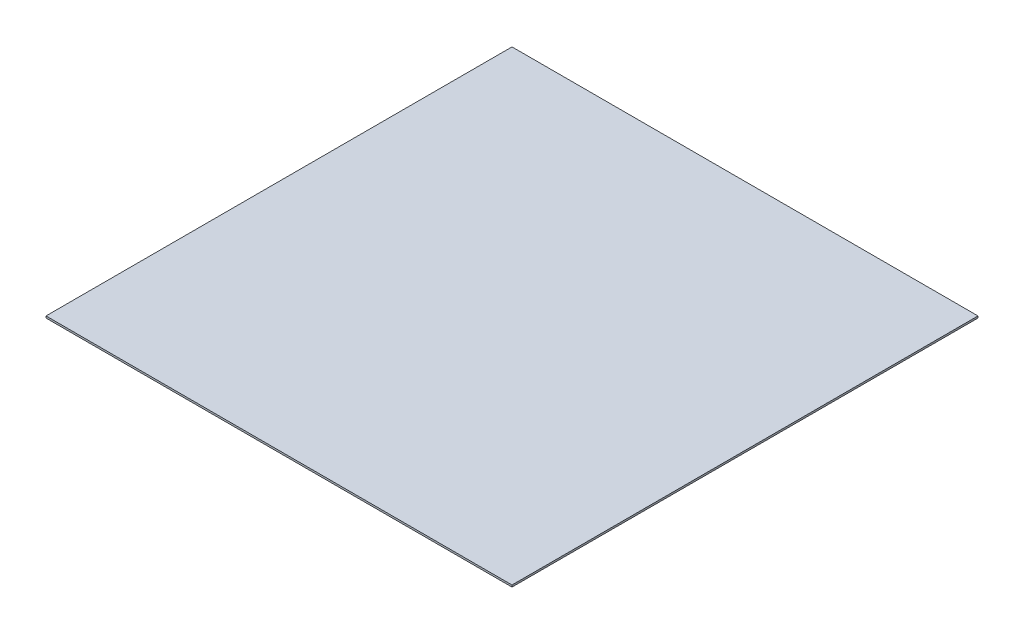
ISO-10303-21;
HEADER;
FILE_DESCRIPTION(('STEP AP214'),'2;1');
FILE_NAME('part.step','',(''),(''),'','','');
FILE_SCHEMA(('AUTOMOTIVE_DESIGN { 1 0 10303 214 1 1 1 1 }'));
ENDSEC;
DATA;
#1=APPLICATION_CONTEXT('core data for automotive mechanical design processes');
#2=APPLICATION_PROTOCOL_DEFINITION('international standard','automotive_design',2000,#1);
#3=PRODUCT_CONTEXT('',#1,'mechanical');
#4=PRODUCT('Part','Part','',(#3));
#5=PRODUCT_RELATED_PRODUCT_CATEGORY('part','',(#4));
#6=PRODUCT_DEFINITION_FORMATION('','',#4);
#7=PRODUCT_DEFINITION_CONTEXT('part definition',#1,'design');
#8=PRODUCT_DEFINITION('design','',#6,#7);
#9=PRODUCT_DEFINITION_SHAPE('','',#8);
#10=(LENGTH_UNIT() NAMED_UNIT(*) SI_UNIT(.MILLI.,.METRE.));
#11=(NAMED_UNIT(*) PLANE_ANGLE_UNIT() SI_UNIT($,.RADIAN.));
#12=(NAMED_UNIT(*) SI_UNIT($,.STERADIAN.) SOLID_ANGLE_UNIT());
#13=UNCERTAINTY_MEASURE_WITH_UNIT(LENGTH_MEASURE(1.E-05),#10,'distance_accuracy_value','');
#14=(GEOMETRIC_REPRESENTATION_CONTEXT(3) GLOBAL_UNCERTAINTY_ASSIGNED_CONTEXT((#13)) GLOBAL_UNIT_ASSIGNED_CONTEXT((#10,
#11,#12)) REPRESENTATION_CONTEXT('',''));
#15=CARTESIAN_POINT('',(0.,0.,0.));
#16=DIRECTION('',(0.,0.,1.));
#17=DIRECTION('',(1.,0.,0.));
#18=AXIS2_PLACEMENT_3D('',#15,#16,#17);
#19=CARTESIAN_POINT('',(125.,1.,125.));
#20=DIRECTION('',(-1.,0.,0.));
#21=DIRECTION('',(0.,0.,1.));
#22=AXIS2_PLACEMENT_3D('',#19,#20,#21);
#23=PLANE('',#22);
#24=DIRECTION('',(0.,0.,-1.));
#25=VECTOR('',#24,1.);
#26=CARTESIAN_POINT('',(125.,0.,125.));
#27=LINE('',#26,#25);
#28=CARTESIAN_POINT('',(125.,0.,125.));
#29=VERTEX_POINT('',#28);
#30=CARTESIAN_POINT('',(125.,0.,-125.));
#31=VERTEX_POINT('',#30);
#32=EDGE_CURVE('E113',#29,#31,#27,.T.);
#33=ORIENTED_EDGE('',*,*,#32,.T.);
#34=DIRECTION('',(0.,-1.,0.));
#35=VECTOR('',#34,1.);
#36=CARTESIAN_POINT('',(125.,1.,-125.));
#37=LINE('',#36,#35);
#38=CARTESIAN_POINT('',(125.,1.,-125.));
#39=VERTEX_POINT('',#38);
#40=EDGE_CURVE('E11',#39,#31,#37,.T.);
#41=ORIENTED_EDGE('',*,*,#40,.F.);
#42=DIRECTION('',(0.,0.,-1.));
#43=VECTOR('',#42,1.);
#44=CARTESIAN_POINT('',(125.,1.,125.));
#45=LINE('',#44,#43);
#46=CARTESIAN_POINT('',(125.,1.,125.));
#47=VERTEX_POINT('',#46);
#48=EDGE_CURVE('E97',#47,#39,#45,.T.);
#49=ORIENTED_EDGE('',*,*,#48,.F.);
#50=DIRECTION('',(0.,-1.,0.));
#51=VECTOR('',#50,1.);
#52=CARTESIAN_POINT('',(125.,1.,125.));
#53=LINE('',#52,#51);
#54=EDGE_CURVE('E109',#47,#29,#53,.T.);
#55=ORIENTED_EDGE('',*,*,#54,.T.);
#56=EDGE_LOOP('',(#33,#41,#49,#55));
#57=FACE_BOUND('',#56,.T.);
#58=ADVANCED_FACE('F45',(#57),#23,.F.);
#59=CARTESIAN_POINT('',(-125.,1.,-125.));
#60=DIRECTION('',(0.,0.,1.));
#61=DIRECTION('',(1.,0.,0.));
#62=AXIS2_PLACEMENT_3D('',#59,#60,#61);
#63=PLANE('',#62);
#64=DIRECTION('',(-1.,0.,0.));
#65=VECTOR('',#64,1.);
#66=CARTESIAN_POINT('',(-125.,0.,-125.));
#67=LINE('',#66,#65);
#68=CARTESIAN_POINT('',(-125.,0.,-125.));
#69=VERTEX_POINT('',#68);
#70=EDGE_CURVE('E102',#31,#69,#67,.T.);
#71=ORIENTED_EDGE('',*,*,#70,.T.);
#72=DIRECTION('',(0.,-1.,0.));
#73=VECTOR('',#72,1.);
#74=CARTESIAN_POINT('',(-125.,1.,-125.));
#75=LINE('',#74,#73);
#76=CARTESIAN_POINT('',(-125.,1.,-125.));
#77=VERTEX_POINT('',#76);
#78=EDGE_CURVE('E54',#77,#69,#75,.T.);
#79=ORIENTED_EDGE('',*,*,#78,.F.);
#80=DIRECTION('',(-1.,0.,0.));
#81=VECTOR('',#80,1.);
#82=CARTESIAN_POINT('',(-125.,1.,-125.));
#83=LINE('',#82,#81);
#84=EDGE_CURVE('E92',#39,#77,#83,.T.);
#85=ORIENTED_EDGE('',*,*,#84,.F.);
#86=ORIENTED_EDGE('',*,*,#40,.T.);
#87=EDGE_LOOP('',(#71,#79,#85,#86));
#88=FACE_BOUND('',#87,.T.);
#89=ADVANCED_FACE('F101',(#88),#63,.F.);
#90=CARTESIAN_POINT('',(-125.,1.,125.));
#91=DIRECTION('',(1.,0.,0.));
#92=DIRECTION('',(0.,0.,-1.));
#93=AXIS2_PLACEMENT_3D('',#90,#91,#92);
#94=PLANE('',#93);
#95=DIRECTION('',(0.,0.,1.));
#96=VECTOR('',#95,1.);
#97=CARTESIAN_POINT('',(-125.,0.,125.));
#98=LINE('',#97,#96);
#99=CARTESIAN_POINT('',(-125.,0.,125.));
#100=VERTEX_POINT('',#99);
#101=EDGE_CURVE('E79',#69,#100,#98,.T.);
#102=ORIENTED_EDGE('',*,*,#101,.T.);
#103=DIRECTION('',(0.,-1.,0.));
#104=VECTOR('',#103,1.);
#105=CARTESIAN_POINT('',(-125.,1.,125.));
#106=LINE('',#105,#104);
#107=CARTESIAN_POINT('',(-125.,1.,125.));
#108=VERTEX_POINT('',#107);
#109=EDGE_CURVE('E104',#108,#100,#106,.T.);
#110=ORIENTED_EDGE('',*,*,#109,.F.);
#111=DIRECTION('',(0.,0.,1.));
#112=VECTOR('',#111,1.);
#113=CARTESIAN_POINT('',(-125.,1.,125.));
#114=LINE('',#113,#112);
#115=EDGE_CURVE('E95',#77,#108,#114,.T.);
#116=ORIENTED_EDGE('',*,*,#115,.F.);
#117=ORIENTED_EDGE('',*,*,#78,.T.);
#118=EDGE_LOOP('',(#102,#110,#116,#117));
#119=FACE_BOUND('',#118,.T.);
#120=ADVANCED_FACE('F105',(#119),#94,.F.);
#121=CARTESIAN_POINT('',(-125.,1.,125.));
#122=DIRECTION('',(0.,0.,-1.));
#123=DIRECTION('',(-1.,0.,0.));
#124=AXIS2_PLACEMENT_3D('',#121,#122,#123);
#125=PLANE('',#124);
#126=DIRECTION('',(1.,0.,0.));
#127=VECTOR('',#126,1.);
#128=CARTESIAN_POINT('',(-125.,0.,125.));
#129=LINE('',#128,#127);
#130=EDGE_CURVE('E85',#100,#29,#129,.T.);
#131=ORIENTED_EDGE('',*,*,#130,.T.);
#132=ORIENTED_EDGE('',*,*,#54,.F.);
#133=DIRECTION('',(1.,0.,0.));
#134=VECTOR('',#133,1.);
#135=CARTESIAN_POINT('',(-125.,1.,125.));
#136=LINE('',#135,#134);
#137=EDGE_CURVE('E62',#108,#47,#136,.T.);
#138=ORIENTED_EDGE('',*,*,#137,.F.);
#139=ORIENTED_EDGE('',*,*,#109,.T.);
#140=EDGE_LOOP('',(#131,#132,#138,#139));
#141=FACE_BOUND('',#140,.T.);
#142=ADVANCED_FACE('F126',(#141),#125,.F.);
#143=CARTESIAN_POINT('',(0.,1.,0.));
#144=DIRECTION('',(0.,-1.,0.));
#145=DIRECTION('',(0.,0.,-1.));
#146=AXIS2_PLACEMENT_3D('',#143,#144,#145);
#147=PLANE('',#146);
#148=ORIENTED_EDGE('',*,*,#48,.T.);
#149=ORIENTED_EDGE('',*,*,#84,.T.);
#150=ORIENTED_EDGE('',*,*,#115,.T.);
#151=ORIENTED_EDGE('',*,*,#137,.T.);
#152=EDGE_LOOP('',(#148,#149,#150,#151));
#153=FACE_BOUND('',#152,.T.);
#154=ADVANCED_FACE('F93',(#153),#147,.F.);
#155=CARTESIAN_POINT('',(0.,0.,0.));
#156=DIRECTION('',(0.,-1.,0.));
#157=DIRECTION('',(0.,0.,-1.));
#158=AXIS2_PLACEMENT_3D('',#155,#156,#157);
#159=PLANE('',#158);
#160=ORIENTED_EDGE('',*,*,#32,.F.);
#161=ORIENTED_EDGE('',*,*,#130,.F.);
#162=ORIENTED_EDGE('',*,*,#101,.F.);
#163=ORIENTED_EDGE('',*,*,#70,.F.);
#164=EDGE_LOOP('',(#160,#161,#162,#163));
#165=FACE_BOUND('',#164,.T.);
#166=ADVANCED_FACE('F129',(#165),#159,.T.);
#167=CLOSED_SHELL('',(#58,#89,#120,#142,#154,#166));
#168=MANIFOLD_SOLID_BREP('B2',#167);
#169=ADVANCED_BREP_SHAPE_REPRESENTATION('',(#18,#168),#14);
#170=SHAPE_DEFINITION_REPRESENTATION(#9,#169);
ENDSEC;
END-ISO-10303-21;
